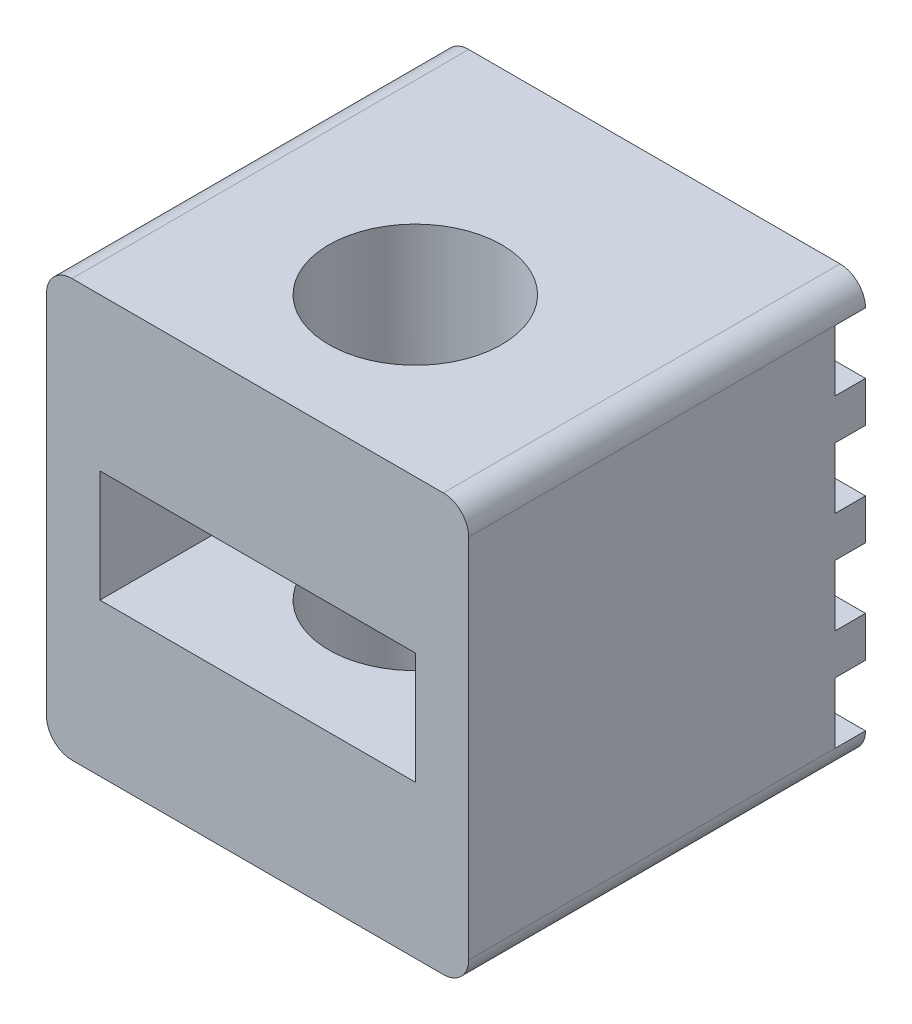
ISO-10303-21;
HEADER;
FILE_DESCRIPTION(('STEP AP214'),'2;1');
FILE_NAME('part.step','',(''),(''),'','','');
FILE_SCHEMA(('AUTOMOTIVE_DESIGN { 1 0 10303 214 1 1 1 1 }'));
ENDSEC;
DATA;
#1=APPLICATION_CONTEXT('core data for automotive mechanical design processes');
#2=APPLICATION_PROTOCOL_DEFINITION('international standard','automotive_design',2000,#1);
#3=PRODUCT_CONTEXT('',#1,'mechanical');
#4=PRODUCT('Part','Part','',(#3));
#5=PRODUCT_RELATED_PRODUCT_CATEGORY('part','',(#4));
#6=PRODUCT_DEFINITION_FORMATION('','',#4);
#7=PRODUCT_DEFINITION_CONTEXT('part definition',#1,'design');
#8=PRODUCT_DEFINITION('design','',#6,#7);
#9=PRODUCT_DEFINITION_SHAPE('','',#8);
#10=(LENGTH_UNIT() NAMED_UNIT(*) SI_UNIT(.MILLI.,.METRE.));
#11=(NAMED_UNIT(*) PLANE_ANGLE_UNIT() SI_UNIT($,.RADIAN.));
#12=(NAMED_UNIT(*) SI_UNIT($,.STERADIAN.) SOLID_ANGLE_UNIT());
#13=UNCERTAINTY_MEASURE_WITH_UNIT(LENGTH_MEASURE(1.E-05),#10,'distance_accuracy_value','');
#14=(GEOMETRIC_REPRESENTATION_CONTEXT(3) GLOBAL_UNCERTAINTY_ASSIGNED_CONTEXT((#13)) GLOBAL_UNIT_ASSIGNED_CONTEXT((#10,
#11,#12)) REPRESENTATION_CONTEXT('',''));
#15=CARTESIAN_POINT('',(0.,0.,0.));
#16=DIRECTION('',(0.,0.,1.));
#17=DIRECTION('',(1.,0.,0.));
#18=AXIS2_PLACEMENT_3D('',#15,#16,#17);
#19=CARTESIAN_POINT('',(-4.15,4.1,-3.9));
#20=DIRECTION('',(0.,0.,1.));
#21=DIRECTION('',(1.,0.,0.));
#22=AXIS2_PLACEMENT_3D('',#19,#20,#21);
#23=PLANE('',#22);
#24=DIRECTION('',(-1.,0.,0.));
#25=VECTOR('',#24,1.);
#26=CARTESIAN_POINT('',(-4.15,4.1,-3.9));
#27=LINE('',#26,#25);
#28=CARTESIAN_POINT('',(3.65,4.1,-3.9));
#29=VERTEX_POINT('',#28);
#30=CARTESIAN_POINT('',(-3.65,4.1,-3.9));
#31=VERTEX_POINT('',#30);
#32=EDGE_CURVE('E354',#29,#31,#27,.T.);
#33=ORIENTED_EDGE('',*,*,#32,.F.);
#34=CARTESIAN_POINT('',(3.65,3.6,-3.9));
#35=DIRECTION('',(0.,0.,1.));
#36=DIRECTION('',(1.,0.,0.));
#37=AXIS2_PLACEMENT_3D('',#34,#35,#36);
#38=CIRCLE('',#37,0.5);
#39=CARTESIAN_POINT('',(4.15,3.6,-3.9));
#40=VERTEX_POINT('',#39);
#41=EDGE_CURVE('E395',#29,#40,#38,.F.);
#42=ORIENTED_EDGE('',*,*,#41,.T.);
#43=DIRECTION('',(-1.,0.,0.));
#44=VECTOR('',#43,1.);
#45=CARTESIAN_POINT('',(-4.15,3.6,-3.9));
#46=LINE('',#45,#44);
#47=CARTESIAN_POINT('',(-4.15,3.6,-3.9));
#48=VERTEX_POINT('',#47);
#49=EDGE_CURVE('E350',#40,#48,#46,.T.);
#50=ORIENTED_EDGE('',*,*,#49,.T.);
#51=CARTESIAN_POINT('',(-3.65,3.6,-3.9));
#52=DIRECTION('',(0.,0.,1.));
#53=DIRECTION('',(1.,0.,0.));
#54=AXIS2_PLACEMENT_3D('',#51,#52,#53);
#55=CIRCLE('',#54,0.5);
#56=EDGE_CURVE('E393',#48,#31,#55,.F.);
#57=ORIENTED_EDGE('',*,*,#56,.T.);
#58=EDGE_LOOP('',(#33,#42,#50,#57));
#59=FACE_BOUND('',#58,.T.);
#60=ADVANCED_FACE('F32',(#59),#23,.F.);
#61=DIRECTION('',(0.,-1.,0.));
#62=VECTOR('',#61,1.);
#63=CARTESIAN_POINT('',(-4.15,4.1,-3.9));
#64=LINE('',#63,#62);
#65=CARTESIAN_POINT('',(-4.15,2.4,-3.9));
#66=VERTEX_POINT('',#65);
#67=CARTESIAN_POINT('',(-4.15,1.6,-3.9));
#68=VERTEX_POINT('',#67);
#69=EDGE_CURVE('E374',#66,#68,#64,.T.);
#70=ORIENTED_EDGE('',*,*,#69,.F.);
#71=DIRECTION('',(-1.,0.,0.));
#72=VECTOR('',#71,1.);
#73=CARTESIAN_POINT('',(4.15,2.4,-3.9));
#74=LINE('',#73,#72);
#75=CARTESIAN_POINT('',(4.15,2.4,-3.9));
#76=VERTEX_POINT('',#75);
#77=EDGE_CURVE('E322',#76,#66,#74,.T.);
#78=ORIENTED_EDGE('',*,*,#77,.F.);
#79=DIRECTION('',(0.,-1.,0.));
#80=VECTOR('',#79,1.);
#81=CARTESIAN_POINT('',(4.15,4.1,-3.9));
#82=LINE('',#81,#80);
#83=CARTESIAN_POINT('',(4.15,1.6,-3.9));
#84=VERTEX_POINT('',#83);
#85=EDGE_CURVE('E379',#76,#84,#82,.T.);
#86=ORIENTED_EDGE('',*,*,#85,.T.);
#87=DIRECTION('',(-1.,0.,0.));
#88=VECTOR('',#87,1.);
#89=CARTESIAN_POINT('',(4.15,1.6,-3.9));
#90=LINE('',#89,#88);
#91=EDGE_CURVE('E324',#84,#68,#90,.T.);
#92=ORIENTED_EDGE('',*,*,#91,.T.);
#93=EDGE_LOOP('',(#70,#78,#86,#92));
#94=FACE_BOUND('',#93,.T.);
#95=ADVANCED_FACE('F472',(#94),#23,.F.);
#96=CARTESIAN_POINT('',(-4.15,0.4,-3.9));
#97=VERTEX_POINT('',#96);
#98=CARTESIAN_POINT('',(-4.15,-0.4,-3.9));
#99=VERTEX_POINT('',#98);
#100=EDGE_CURVE('E373',#97,#99,#64,.T.);
#101=ORIENTED_EDGE('',*,*,#100,.F.);
#102=DIRECTION('',(-1.,0.,0.));
#103=VECTOR('',#102,1.);
#104=CARTESIAN_POINT('',(4.15,0.4,-3.9));
#105=LINE('',#104,#103);
#106=CARTESIAN_POINT('',(4.15,0.4,-3.9));
#107=VERTEX_POINT('',#106);
#108=EDGE_CURVE('E331',#107,#97,#105,.T.);
#109=ORIENTED_EDGE('',*,*,#108,.F.);
#110=CARTESIAN_POINT('',(4.15,-0.4,-3.9));
#111=VERTEX_POINT('',#110);
#112=EDGE_CURVE('E378',#107,#111,#82,.T.);
#113=ORIENTED_EDGE('',*,*,#112,.T.);
#114=DIRECTION('',(-1.,0.,0.));
#115=VECTOR('',#114,1.);
#116=CARTESIAN_POINT('',(4.15,-0.4,-3.9));
#117=LINE('',#116,#115);
#118=EDGE_CURVE('E333',#111,#99,#117,.T.);
#119=ORIENTED_EDGE('',*,*,#118,.T.);
#120=EDGE_LOOP('',(#101,#109,#113,#119));
#121=FACE_BOUND('',#120,.T.);
#122=ADVANCED_FACE('F483',(#121),#23,.F.);
#123=CARTESIAN_POINT('',(-4.15,-1.6,-3.9));
#124=VERTEX_POINT('',#123);
#125=CARTESIAN_POINT('',(-4.15,-2.4,-3.9));
#126=VERTEX_POINT('',#125);
#127=EDGE_CURVE('E370',#124,#126,#64,.T.);
#128=ORIENTED_EDGE('',*,*,#127,.F.);
#129=DIRECTION('',(-1.,0.,0.));
#130=VECTOR('',#129,1.);
#131=CARTESIAN_POINT('',(4.15,-1.6,-3.9));
#132=LINE('',#131,#130);
#133=CARTESIAN_POINT('',(4.15,-1.6,-3.9));
#134=VERTEX_POINT('',#133);
#135=EDGE_CURVE('E340',#134,#124,#132,.T.);
#136=ORIENTED_EDGE('',*,*,#135,.F.);
#137=CARTESIAN_POINT('',(4.15,-2.4,-3.9));
#138=VERTEX_POINT('',#137);
#139=EDGE_CURVE('E375',#134,#138,#82,.T.);
#140=ORIENTED_EDGE('',*,*,#139,.T.);
#141=DIRECTION('',(-1.,0.,0.));
#142=VECTOR('',#141,1.);
#143=CARTESIAN_POINT('',(4.15,-2.4,-3.9));
#144=LINE('',#143,#142);
#145=EDGE_CURVE('E342',#138,#126,#144,.T.);
#146=ORIENTED_EDGE('',*,*,#145,.T.);
#147=EDGE_LOOP('',(#128,#136,#140,#146));
#148=FACE_BOUND('',#147,.T.);
#149=ADVANCED_FACE('F498',(#148),#23,.F.);
#150=CARTESIAN_POINT('',(4.15,4.1,3.9));
#151=DIRECTION('',(-1.,0.,0.));
#152=DIRECTION('',(0.,0.,1.));
#153=AXIS2_PLACEMENT_3D('',#150,#151,#152);
#154=PLANE('',#153);
#155=DIRECTION('',(0.,1.,0.));
#156=VECTOR('',#155,1.);
#157=CARTESIAN_POINT('',(4.15,3.6,-3.3));
#158=LINE('',#157,#156);
#159=CARTESIAN_POINT('',(4.15,2.4,-3.3));
#160=VERTEX_POINT('',#159);
#161=CARTESIAN_POINT('',(4.15,3.6,-3.3));
#162=VERTEX_POINT('',#161);
#163=EDGE_CURVE('E282',#160,#162,#158,.T.);
#164=ORIENTED_EDGE('',*,*,#163,.T.);
#165=DIRECTION('',(0.,0.,-1.));
#166=VECTOR('',#165,1.);
#167=CARTESIAN_POINT('',(4.15,3.6,3.9));
#168=LINE('',#167,#166);
#169=CARTESIAN_POINT('',(4.15,3.6,3.9));
#170=VERTEX_POINT('',#169);
#171=EDGE_CURVE('E400',#162,#170,#168,.F.);
#172=ORIENTED_EDGE('',*,*,#171,.T.);
#173=DIRECTION('',(0.,-1.,0.));
#174=VECTOR('',#173,1.);
#175=CARTESIAN_POINT('',(4.15,4.1,3.9));
#176=LINE('',#175,#174);
#177=CARTESIAN_POINT('',(4.15,-3.6,3.9));
#178=VERTEX_POINT('',#177);
#179=EDGE_CURVE('E361',#170,#178,#176,.T.);
#180=ORIENTED_EDGE('',*,*,#179,.T.);
#181=DIRECTION('',(0.,0.,-1.));
#182=VECTOR('',#181,1.);
#183=CARTESIAN_POINT('',(4.15,-3.6,-3.9));
#184=LINE('',#183,#182);
#185=CARTESIAN_POINT('',(4.15,-3.6,-3.3));
#186=VERTEX_POINT('',#185);
#187=EDGE_CURVE('E397',#178,#186,#184,.T.);
#188=ORIENTED_EDGE('',*,*,#187,.T.);
#189=DIRECTION('',(0.,1.,0.));
#190=VECTOR('',#189,1.);
#191=CARTESIAN_POINT('',(4.15,-2.4,-3.3));
#192=LINE('',#191,#190);
#193=CARTESIAN_POINT('',(4.15,-2.4,-3.3));
#194=VERTEX_POINT('',#193);
#195=EDGE_CURVE('E254',#186,#194,#192,.T.);
#196=ORIENTED_EDGE('',*,*,#195,.T.);
#197=DIRECTION('',(0.,0.,-1.));
#198=VECTOR('',#197,1.);
#199=CARTESIAN_POINT('',(4.15,-2.4,-3.9));
#200=LINE('',#199,#198);
#201=EDGE_CURVE('E258',#194,#138,#200,.T.);
#202=ORIENTED_EDGE('',*,*,#201,.T.);
#203=ORIENTED_EDGE('',*,*,#139,.F.);
#204=DIRECTION('',(0.,0.,1.));
#205=VECTOR('',#204,1.);
#206=CARTESIAN_POINT('',(4.15,-1.6,-3.3));
#207=LINE('',#206,#205);
#208=CARTESIAN_POINT('',(4.15,-1.6,-3.3));
#209=VERTEX_POINT('',#208);
#210=EDGE_CURVE('E261',#134,#209,#207,.T.);
#211=ORIENTED_EDGE('',*,*,#210,.T.);
#212=DIRECTION('',(0.,1.,0.));
#213=VECTOR('',#212,1.);
#214=CARTESIAN_POINT('',(4.15,-0.4,-3.3));
#215=LINE('',#214,#213);
#216=CARTESIAN_POINT('',(4.15,-0.4,-3.3));
#217=VERTEX_POINT('',#216);
#218=EDGE_CURVE('E264',#209,#217,#215,.T.);
#219=ORIENTED_EDGE('',*,*,#218,.T.);
#220=DIRECTION('',(0.,0.,-1.));
#221=VECTOR('',#220,1.);
#222=CARTESIAN_POINT('',(4.15,-0.4,-3.9));
#223=LINE('',#222,#221);
#224=EDGE_CURVE('E267',#217,#111,#223,.T.);
#225=ORIENTED_EDGE('',*,*,#224,.T.);
#226=ORIENTED_EDGE('',*,*,#112,.F.);
#227=DIRECTION('',(0.,0.,1.));
#228=VECTOR('',#227,1.);
#229=CARTESIAN_POINT('',(4.15,0.4,-3.3));
#230=LINE('',#229,#228);
#231=CARTESIAN_POINT('',(4.15,0.4,-3.3));
#232=VERTEX_POINT('',#231);
#233=EDGE_CURVE('E270',#107,#232,#230,.T.);
#234=ORIENTED_EDGE('',*,*,#233,.T.);
#235=DIRECTION('',(0.,1.,0.));
#236=VECTOR('',#235,1.);
#237=CARTESIAN_POINT('',(4.15,1.6,-3.3));
#238=LINE('',#237,#236);
#239=CARTESIAN_POINT('',(4.15,1.6,-3.3));
#240=VERTEX_POINT('',#239);
#241=EDGE_CURVE('E273',#232,#240,#238,.T.);
#242=ORIENTED_EDGE('',*,*,#241,.T.);
#243=DIRECTION('',(0.,0.,-1.));
#244=VECTOR('',#243,1.);
#245=CARTESIAN_POINT('',(4.15,1.6,-3.9));
#246=LINE('',#245,#244);
#247=EDGE_CURVE('E276',#240,#84,#246,.T.);
#248=ORIENTED_EDGE('',*,*,#247,.T.);
#249=ORIENTED_EDGE('',*,*,#85,.F.);
#250=DIRECTION('',(0.,0.,1.));
#251=VECTOR('',#250,1.);
#252=CARTESIAN_POINT('',(4.15,2.4,-3.3));
#253=LINE('',#252,#251);
#254=EDGE_CURVE('E279',#76,#160,#253,.T.);
#255=ORIENTED_EDGE('',*,*,#254,.T.);
#256=EDGE_LOOP('',(#164,#172,#180,#188,#196,#202,#203,#211,#219,#225,#226,#234,#242,#248,#249,#255));
#257=FACE_BOUND('',#256,.T.);
#258=ADVANCED_FACE('F441',(#257),#154,.F.);
#259=DIRECTION('',(1.,0.,0.));
#260=VECTOR('',#259,1.);
#261=CARTESIAN_POINT('',(-4.15,-3.6,-3.9));
#262=LINE('',#261,#260);
#263=CARTESIAN_POINT('',(-4.15,-3.6,-3.9));
#264=VERTEX_POINT('',#263);
#265=CARTESIAN_POINT('',(4.15,-3.6,-3.9));
#266=VERTEX_POINT('',#265);
#267=EDGE_CURVE('E319',#264,#266,#262,.T.);
#268=ORIENTED_EDGE('',*,*,#267,.T.);
#269=CARTESIAN_POINT('',(3.65,-3.6,-3.9));
#270=DIRECTION('',(0.,0.,1.));
#271=DIRECTION('',(1.,0.,0.));
#272=AXIS2_PLACEMENT_3D('',#269,#270,#271);
#273=CIRCLE('',#272,0.5);
#274=CARTESIAN_POINT('',(3.65,-4.1,-3.9));
#275=VERTEX_POINT('',#274);
#276=EDGE_CURVE('E54',#266,#275,#273,.F.);
#277=ORIENTED_EDGE('',*,*,#276,.T.);
#278=DIRECTION('',(-1.,0.,0.));
#279=VECTOR('',#278,1.);
#280=CARTESIAN_POINT('',(-4.15,-4.1,-3.9));
#281=LINE('',#280,#279);
#282=CARTESIAN_POINT('',(-3.65,-4.1,-3.9));
#283=VERTEX_POINT('',#282);
#284=EDGE_CURVE('E353',#275,#283,#281,.T.);
#285=ORIENTED_EDGE('',*,*,#284,.T.);
#286=CARTESIAN_POINT('',(-3.65,-3.6,-3.9));
#287=DIRECTION('',(0.,0.,1.));
#288=DIRECTION('',(1.,0.,0.));
#289=AXIS2_PLACEMENT_3D('',#286,#287,#288);
#290=CIRCLE('',#289,0.5);
#291=EDGE_CURVE('E410',#283,#264,#290,.F.);
#292=ORIENTED_EDGE('',*,*,#291,.T.);
#293=EDGE_LOOP('',(#268,#277,#285,#292));
#294=FACE_BOUND('',#293,.T.);
#295=ADVANCED_FACE('F430',(#294),#23,.F.);
#296=CARTESIAN_POINT('',(-4.15,4.1,3.9));
#297=DIRECTION('',(1.,0.,0.));
#298=DIRECTION('',(0.,0.,-1.));
#299=AXIS2_PLACEMENT_3D('',#296,#297,#298);
#300=PLANE('',#299);
#301=DIRECTION('',(0.,-1.,0.));
#302=VECTOR('',#301,1.);
#303=CARTESIAN_POINT('',(-4.15,4.1,3.9));
#304=LINE('',#303,#302);
#305=CARTESIAN_POINT('',(-4.15,3.6,3.9));
#306=VERTEX_POINT('',#305);
#307=CARTESIAN_POINT('',(-4.15,-3.6,3.9));
#308=VERTEX_POINT('',#307);
#309=EDGE_CURVE('E367',#306,#308,#304,.T.);
#310=ORIENTED_EDGE('',*,*,#309,.F.);
#311=DIRECTION('',(0.,0.,1.));
#312=VECTOR('',#311,1.);
#313=CARTESIAN_POINT('',(-4.15,3.6,3.9));
#314=LINE('',#313,#312);
#315=CARTESIAN_POINT('',(-4.15,3.6,-3.3));
#316=VERTEX_POINT('',#315);
#317=EDGE_CURVE('E11',#306,#316,#314,.F.);
#318=ORIENTED_EDGE('',*,*,#317,.T.);
#319=DIRECTION('',(0.,1.,0.));
#320=VECTOR('',#319,1.);
#321=CARTESIAN_POINT('',(-4.15,3.6,-3.3));
#322=LINE('',#321,#320);
#323=CARTESIAN_POINT('',(-4.15,2.4,-3.3));
#324=VERTEX_POINT('',#323);
#325=EDGE_CURVE('E312',#324,#316,#322,.T.);
#326=ORIENTED_EDGE('',*,*,#325,.F.);
#327=DIRECTION('',(0.,0.,1.));
#328=VECTOR('',#327,1.);
#329=CARTESIAN_POINT('',(-4.15,2.4,-3.3));
#330=LINE('',#329,#328);
#331=EDGE_CURVE('E309',#66,#324,#330,.T.);
#332=ORIENTED_EDGE('',*,*,#331,.F.);
#333=ORIENTED_EDGE('',*,*,#69,.T.);
#334=DIRECTION('',(0.,0.,-1.));
#335=VECTOR('',#334,1.);
#336=CARTESIAN_POINT('',(-4.15,1.6,-3.9));
#337=LINE('',#336,#335);
#338=CARTESIAN_POINT('',(-4.15,1.6,-3.3));
#339=VERTEX_POINT('',#338);
#340=EDGE_CURVE('E307',#339,#68,#337,.T.);
#341=ORIENTED_EDGE('',*,*,#340,.F.);
#342=DIRECTION('',(0.,1.,0.));
#343=VECTOR('',#342,1.);
#344=CARTESIAN_POINT('',(-4.15,1.6,-3.3));
#345=LINE('',#344,#343);
#346=CARTESIAN_POINT('',(-4.15,0.4,-3.3));
#347=VERTEX_POINT('',#346);
#348=EDGE_CURVE('E304',#347,#339,#345,.T.);
#349=ORIENTED_EDGE('',*,*,#348,.F.);
#350=DIRECTION('',(0.,0.,1.));
#351=VECTOR('',#350,1.);
#352=CARTESIAN_POINT('',(-4.15,0.4,-3.3));
#353=LINE('',#352,#351);
#354=EDGE_CURVE('E301',#97,#347,#353,.T.);
#355=ORIENTED_EDGE('',*,*,#354,.F.);
#356=ORIENTED_EDGE('',*,*,#100,.T.);
#357=DIRECTION('',(0.,0.,-1.));
#358=VECTOR('',#357,1.);
#359=CARTESIAN_POINT('',(-4.15,-0.4,-3.9));
#360=LINE('',#359,#358);
#361=CARTESIAN_POINT('',(-4.15,-0.4,-3.3));
#362=VERTEX_POINT('',#361);
#363=EDGE_CURVE('E299',#362,#99,#360,.T.);
#364=ORIENTED_EDGE('',*,*,#363,.F.);
#365=DIRECTION('',(0.,1.,0.));
#366=VECTOR('',#365,1.);
#367=CARTESIAN_POINT('',(-4.15,-0.4,-3.3));
#368=LINE('',#367,#366);
#369=CARTESIAN_POINT('',(-4.15,-1.6,-3.3));
#370=VERTEX_POINT('',#369);
#371=EDGE_CURVE('E296',#370,#362,#368,.T.);
#372=ORIENTED_EDGE('',*,*,#371,.F.);
#373=DIRECTION('',(0.,0.,1.));
#374=VECTOR('',#373,1.);
#375=CARTESIAN_POINT('',(-4.15,-1.6,-3.3));
#376=LINE('',#375,#374);
#377=EDGE_CURVE('E293',#124,#370,#376,.T.);
#378=ORIENTED_EDGE('',*,*,#377,.F.);
#379=ORIENTED_EDGE('',*,*,#127,.T.);
#380=DIRECTION('',(0.,0.,-1.));
#381=VECTOR('',#380,1.);
#382=CARTESIAN_POINT('',(-4.15,-2.4,-3.9));
#383=LINE('',#382,#381);
#384=CARTESIAN_POINT('',(-4.15,-2.4,-3.3));
#385=VERTEX_POINT('',#384);
#386=EDGE_CURVE('E291',#385,#126,#383,.T.);
#387=ORIENTED_EDGE('',*,*,#386,.F.);
#388=DIRECTION('',(0.,1.,0.));
#389=VECTOR('',#388,1.);
#390=CARTESIAN_POINT('',(-4.15,-2.4,-3.3));
#391=LINE('',#390,#389);
#392=CARTESIAN_POINT('',(-4.15,-3.6,-3.3));
#393=VERTEX_POINT('',#392);
#394=EDGE_CURVE('E248',#393,#385,#391,.T.);
#395=ORIENTED_EDGE('',*,*,#394,.F.);
#396=DIRECTION('',(0.,0.,1.));
#397=VECTOR('',#396,1.);
#398=CARTESIAN_POINT('',(-4.15,-3.6,3.9));
#399=LINE('',#398,#397);
#400=EDGE_CURVE('E40',#393,#308,#399,.T.);
#401=ORIENTED_EDGE('',*,*,#400,.T.);
#402=EDGE_LOOP('',(#310,#318,#326,#332,#333,#341,#349,#355,#356,#364,#372,#378,#379,#387,#395,#401));
#403=FACE_BOUND('',#402,.T.);
#404=ADVANCED_FACE('F418',(#403),#300,.F.);
#405=CARTESIAN_POINT('',(-4.15,4.1,3.9));
#406=DIRECTION('',(0.,0.,-1.));
#407=DIRECTION('',(-1.,0.,0.));
#408=AXIS2_PLACEMENT_3D('',#405,#406,#407);
#409=PLANE('',#408);
#410=DIRECTION('',(-1.,0.,0.));
#411=VECTOR('',#410,1.);
#412=CARTESIAN_POINT('',(-3.1,1.1,3.9));
#413=LINE('',#412,#411);
#414=CARTESIAN_POINT('',(3.1,1.1,3.9));
#415=VERTEX_POINT('',#414);
#416=CARTESIAN_POINT('',(-3.1,1.1,3.9));
#417=VERTEX_POINT('',#416);
#418=EDGE_CURVE('E242',#415,#417,#413,.T.);
#419=ORIENTED_EDGE('',*,*,#418,.F.);
#420=DIRECTION('',(0.,1.,0.));
#421=VECTOR('',#420,1.);
#422=CARTESIAN_POINT('',(3.1,-1.1,3.9));
#423=LINE('',#422,#421);
#424=CARTESIAN_POINT('',(3.1,-1.1,3.9));
#425=VERTEX_POINT('',#424);
#426=EDGE_CURVE('E213',#425,#415,#423,.T.);
#427=ORIENTED_EDGE('',*,*,#426,.F.);
#428=DIRECTION('',(1.,0.,0.));
#429=VECTOR('',#428,1.);
#430=CARTESIAN_POINT('',(-3.1,-1.1,3.9));
#431=LINE('',#430,#429);
#432=CARTESIAN_POINT('',(-3.1,-1.1,3.9));
#433=VERTEX_POINT('',#432);
#434=EDGE_CURVE('E230',#433,#425,#431,.T.);
#435=ORIENTED_EDGE('',*,*,#434,.F.);
#436=DIRECTION('',(0.,-1.,0.));
#437=VECTOR('',#436,1.);
#438=CARTESIAN_POINT('',(-3.1,-1.1,3.9));
#439=LINE('',#438,#437);
#440=EDGE_CURVE('E233',#417,#433,#439,.T.);
#441=ORIENTED_EDGE('',*,*,#440,.F.);
#442=EDGE_LOOP('',(#419,#427,#435,#441));
#443=FACE_BOUND('',#442,.T.);
#444=ORIENTED_EDGE('',*,*,#179,.F.);
#445=CARTESIAN_POINT('',(3.65,3.6,3.9));
#446=DIRECTION('',(0.,0.,-1.));
#447=DIRECTION('',(-1.,0.,0.));
#448=AXIS2_PLACEMENT_3D('',#445,#446,#447);
#449=CIRCLE('',#448,0.5);
#450=CARTESIAN_POINT('',(3.65,4.1,3.9));
#451=VERTEX_POINT('',#450);
#452=EDGE_CURVE('E408',#170,#451,#449,.F.);
#453=ORIENTED_EDGE('',*,*,#452,.T.);
#454=DIRECTION('',(1.,0.,0.));
#455=VECTOR('',#454,1.);
#456=CARTESIAN_POINT('',(-4.15,4.1,3.9));
#457=LINE('',#456,#455);
#458=CARTESIAN_POINT('',(-3.65,4.1,3.9));
#459=VERTEX_POINT('',#458);
#460=EDGE_CURVE('E357',#459,#451,#457,.T.);
#461=ORIENTED_EDGE('',*,*,#460,.F.);
#462=CARTESIAN_POINT('',(-3.65,3.6,3.9));
#463=DIRECTION('',(0.,0.,-1.));
#464=DIRECTION('',(-1.,0.,0.));
#465=AXIS2_PLACEMENT_3D('',#462,#463,#464);
#466=CIRCLE('',#465,0.5);
#467=EDGE_CURVE('E404',#459,#306,#466,.F.);
#468=ORIENTED_EDGE('',*,*,#467,.T.);
#469=ORIENTED_EDGE('',*,*,#309,.T.);
#470=CARTESIAN_POINT('',(-3.65,-3.6,3.9));
#471=DIRECTION('',(0.,0.,-1.));
#472=DIRECTION('',(-1.,0.,0.));
#473=AXIS2_PLACEMENT_3D('',#470,#471,#472);
#474=CIRCLE('',#473,0.5);
#475=CARTESIAN_POINT('',(-3.65,-4.1,3.9));
#476=VERTEX_POINT('',#475);
#477=EDGE_CURVE('E402',#308,#476,#474,.F.);
#478=ORIENTED_EDGE('',*,*,#477,.T.);
#479=DIRECTION('',(1.,0.,0.));
#480=VECTOR('',#479,1.);
#481=CARTESIAN_POINT('',(-4.15,-4.1,3.9));
#482=LINE('',#481,#480);
#483=CARTESIAN_POINT('',(3.65,-4.1,3.9));
#484=VERTEX_POINT('',#483);
#485=EDGE_CURVE('E358',#476,#484,#482,.T.);
#486=ORIENTED_EDGE('',*,*,#485,.T.);
#487=CARTESIAN_POINT('',(3.65,-3.6,3.9));
#488=DIRECTION('',(0.,0.,-1.));
#489=DIRECTION('',(-1.,0.,0.));
#490=AXIS2_PLACEMENT_3D('',#487,#488,#489);
#491=CIRCLE('',#490,0.5);
#492=EDGE_CURVE('E406',#484,#178,#491,.F.);
#493=ORIENTED_EDGE('',*,*,#492,.T.);
#494=EDGE_LOOP('',(#444,#453,#461,#468,#469,#478,#486,#493));
#495=FACE_BOUND('',#494,.T.);
#496=ADVANCED_FACE('F426',(#443,#495),#409,.F.);
#497=CARTESIAN_POINT('',(0.,4.1,0.));
#498=DIRECTION('',(0.,-1.,0.));
#499=DIRECTION('',(0.,0.,-1.));
#500=AXIS2_PLACEMENT_3D('',#497,#498,#499);
#501=PLANE('',#500);
#502=CARTESIAN_POINT('',(0.,4.1,0.800000000000001));
#503=DIRECTION('',(0.,-1.,0.));
#504=DIRECTION('',(0.,0.,-1.));
#505=AXIS2_PLACEMENT_3D('',#502,#503,#504);
#506=CIRCLE('',#505,1.7);
#507=CARTESIAN_POINT('',(0.,4.1,-0.899999999999999));
#508=VERTEX_POINT('',#507);
#509=EDGE_CURVE('E387',#508,#508,#506,.T.);
#510=ORIENTED_EDGE('',*,*,#509,.T.);
#511=EDGE_LOOP('',(#510));
#512=FACE_BOUND('',#511,.T.);
#513=ORIENTED_EDGE('',*,*,#460,.T.);
#514=DIRECTION('',(0.,0.,-1.));
#515=VECTOR('',#514,1.);
#516=CARTESIAN_POINT('',(3.65,4.1,0.));
#517=LINE('',#516,#515);
#518=EDGE_CURVE('E390',#451,#29,#517,.T.);
#519=ORIENTED_EDGE('',*,*,#518,.T.);
#520=ORIENTED_EDGE('',*,*,#32,.T.);
#521=DIRECTION('',(0.,0.,1.));
#522=VECTOR('',#521,1.);
#523=CARTESIAN_POINT('',(-3.65,4.1,0.));
#524=LINE('',#523,#522);
#525=EDGE_CURVE('E383',#31,#459,#524,.T.);
#526=ORIENTED_EDGE('',*,*,#525,.T.);
#527=EDGE_LOOP('',(#513,#519,#520,#526));
#528=FACE_BOUND('',#527,.T.);
#529=ADVANCED_FACE('F449',(#512,#528),#501,.F.);
#530=CARTESIAN_POINT('',(0.,-4.1,0.));
#531=DIRECTION('',(0.,-1.,0.));
#532=DIRECTION('',(0.,0.,-1.));
#533=AXIS2_PLACEMENT_3D('',#530,#531,#532);
#534=PLANE('',#533);
#535=CARTESIAN_POINT('',(0.,-4.1,0.800000000000001));
#536=DIRECTION('',(0.,-1.,0.));
#537=DIRECTION('',(0.,0.,-1.));
#538=AXIS2_PLACEMENT_3D('',#535,#536,#537);
#539=CIRCLE('',#538,1.7);
#540=CARTESIAN_POINT('',(0.,-4.1,-0.899999999999999));
#541=VERTEX_POINT('',#540);
#542=EDGE_CURVE('E739',#541,#541,#539,.T.);
#543=ORIENTED_EDGE('',*,*,#542,.F.);
#544=EDGE_LOOP('',(#543));
#545=FACE_BOUND('',#544,.T.);
#546=ORIENTED_EDGE('',*,*,#284,.F.);
#547=DIRECTION('',(0.,0.,-1.));
#548=VECTOR('',#547,1.);
#549=CARTESIAN_POINT('',(3.65,-4.1,3.9));
#550=LINE('',#549,#548);
#551=EDGE_CURVE('E414',#275,#484,#550,.F.);
#552=ORIENTED_EDGE('',*,*,#551,.T.);
#553=ORIENTED_EDGE('',*,*,#485,.F.);
#554=DIRECTION('',(0.,0.,1.));
#555=VECTOR('',#554,1.);
#556=CARTESIAN_POINT('',(-3.65,-4.1,-3.9));
#557=LINE('',#556,#555);
#558=EDGE_CURVE('E47',#476,#283,#557,.F.);
#559=ORIENTED_EDGE('',*,*,#558,.T.);
#560=EDGE_LOOP('',(#546,#552,#553,#559));
#561=FACE_BOUND('',#560,.T.);
#562=ADVANCED_FACE('F512',(#545,#561),#534,.T.);
#563=CARTESIAN_POINT('',(4.15,-3.6,-3.3));
#564=DIRECTION('',(0.,-1.,0.));
#565=DIRECTION('',(0.,0.,-1.));
#566=AXIS2_PLACEMENT_3D('',#563,#564,#565);
#567=PLANE('',#566);
#568=DIRECTION('',(0.,0.,-1.));
#569=VECTOR('',#568,1.);
#570=CARTESIAN_POINT('',(-4.15,-3.6,3.9));
#571=LINE('',#570,#569);
#572=EDGE_CURVE('E380',#393,#264,#571,.T.);
#573=ORIENTED_EDGE('',*,*,#572,.F.);
#574=DIRECTION('',(-1.,0.,0.));
#575=VECTOR('',#574,1.);
#576=CARTESIAN_POINT('',(4.15,-3.6,-3.3));
#577=LINE('',#576,#575);
#578=EDGE_CURVE('E288',#186,#393,#577,.T.);
#579=ORIENTED_EDGE('',*,*,#578,.F.);
#580=DIRECTION('',(0.,0.,1.));
#581=VECTOR('',#580,1.);
#582=CARTESIAN_POINT('',(4.15,-3.6,-3.3));
#583=LINE('',#582,#581);
#584=EDGE_CURVE('E252',#266,#186,#583,.T.);
#585=ORIENTED_EDGE('',*,*,#584,.F.);
#586=ORIENTED_EDGE('',*,*,#267,.F.);
#587=EDGE_LOOP('',(#573,#579,#585,#586));
#588=FACE_BOUND('',#587,.T.);
#589=ADVANCED_FACE('F432',(#588),#567,.F.);
#590=CARTESIAN_POINT('',(4.15,-2.4,-3.3));
#591=DIRECTION('',(0.,0.,1.));
#592=DIRECTION('',(1.,0.,0.));
#593=AXIS2_PLACEMENT_3D('',#590,#591,#592);
#594=PLANE('',#593);
#595=ORIENTED_EDGE('',*,*,#394,.T.);
#596=DIRECTION('',(-1.,0.,0.));
#597=VECTOR('',#596,1.);
#598=CARTESIAN_POINT('',(4.15,-2.4,-3.3));
#599=LINE('',#598,#597);
#600=EDGE_CURVE('E345',#194,#385,#599,.T.);
#601=ORIENTED_EDGE('',*,*,#600,.F.);
#602=ORIENTED_EDGE('',*,*,#195,.F.);
#603=ORIENTED_EDGE('',*,*,#578,.T.);
#604=EDGE_LOOP('',(#595,#601,#602,#603));
#605=FACE_BOUND('',#604,.T.);
#606=ADVANCED_FACE('F503',(#605),#594,.F.);
#607=CARTESIAN_POINT('',(4.15,-2.4,-3.9));
#608=DIRECTION('',(0.,1.,0.));
#609=DIRECTION('',(0.,0.,1.));
#610=AXIS2_PLACEMENT_3D('',#607,#608,#609);
#611=PLANE('',#610);
#612=ORIENTED_EDGE('',*,*,#386,.T.);
#613=ORIENTED_EDGE('',*,*,#145,.F.);
#614=ORIENTED_EDGE('',*,*,#201,.F.);
#615=ORIENTED_EDGE('',*,*,#600,.T.);
#616=EDGE_LOOP('',(#612,#613,#614,#615));
#617=FACE_BOUND('',#616,.T.);
#618=ADVANCED_FACE('F501',(#617),#611,.F.);
#619=CARTESIAN_POINT('',(4.15,-1.6,-3.3));
#620=DIRECTION('',(0.,-1.,0.));
#621=DIRECTION('',(0.,0.,-1.));
#622=AXIS2_PLACEMENT_3D('',#619,#620,#621);
#623=PLANE('',#622);
#624=ORIENTED_EDGE('',*,*,#377,.T.);
#625=DIRECTION('',(-1.,0.,0.));
#626=VECTOR('',#625,1.);
#627=CARTESIAN_POINT('',(4.15,-1.6,-3.3));
#628=LINE('',#627,#626);
#629=EDGE_CURVE('E338',#209,#370,#628,.T.);
#630=ORIENTED_EDGE('',*,*,#629,.F.);
#631=ORIENTED_EDGE('',*,*,#210,.F.);
#632=ORIENTED_EDGE('',*,*,#135,.T.);
#633=EDGE_LOOP('',(#624,#630,#631,#632));
#634=FACE_BOUND('',#633,.T.);
#635=ADVANCED_FACE('F510',(#634),#623,.F.);
#636=CARTESIAN_POINT('',(4.15,-0.4,-3.3));
#637=DIRECTION('',(0.,0.,1.));
#638=DIRECTION('',(1.,0.,0.));
#639=AXIS2_PLACEMENT_3D('',#636,#637,#638);
#640=PLANE('',#639);
#641=ORIENTED_EDGE('',*,*,#371,.T.);
#642=DIRECTION('',(-1.,0.,0.));
#643=VECTOR('',#642,1.);
#644=CARTESIAN_POINT('',(4.15,-0.4,-3.3));
#645=LINE('',#644,#643);
#646=EDGE_CURVE('E336',#217,#362,#645,.T.);
#647=ORIENTED_EDGE('',*,*,#646,.F.);
#648=ORIENTED_EDGE('',*,*,#218,.F.);
#649=ORIENTED_EDGE('',*,*,#629,.T.);
#650=EDGE_LOOP('',(#641,#647,#648,#649));
#651=FACE_BOUND('',#650,.T.);
#652=ADVANCED_FACE('F492',(#651),#640,.F.);
#653=CARTESIAN_POINT('',(4.15,-0.4,-3.9));
#654=DIRECTION('',(0.,1.,0.));
#655=DIRECTION('',(0.,0.,1.));
#656=AXIS2_PLACEMENT_3D('',#653,#654,#655);
#657=PLANE('',#656);
#658=ORIENTED_EDGE('',*,*,#363,.T.);
#659=ORIENTED_EDGE('',*,*,#118,.F.);
#660=ORIENTED_EDGE('',*,*,#224,.F.);
#661=ORIENTED_EDGE('',*,*,#646,.T.);
#662=EDGE_LOOP('',(#658,#659,#660,#661));
#663=FACE_BOUND('',#662,.T.);
#664=ADVANCED_FACE('F488',(#663),#657,.F.);
#665=CARTESIAN_POINT('',(4.15,0.4,-3.3));
#666=DIRECTION('',(0.,-1.,0.));
#667=DIRECTION('',(0.,0.,-1.));
#668=AXIS2_PLACEMENT_3D('',#665,#666,#667);
#669=PLANE('',#668);
#670=ORIENTED_EDGE('',*,*,#354,.T.);
#671=DIRECTION('',(-1.,0.,0.));
#672=VECTOR('',#671,1.);
#673=CARTESIAN_POINT('',(4.15,0.4,-3.3));
#674=LINE('',#673,#672);
#675=EDGE_CURVE('E329',#232,#347,#674,.T.);
#676=ORIENTED_EDGE('',*,*,#675,.F.);
#677=ORIENTED_EDGE('',*,*,#233,.F.);
#678=ORIENTED_EDGE('',*,*,#108,.T.);
#679=EDGE_LOOP('',(#670,#676,#677,#678));
#680=FACE_BOUND('',#679,.T.);
#681=ADVANCED_FACE('F585',(#680),#669,.F.);
#682=CARTESIAN_POINT('',(4.15,1.6,-3.3));
#683=DIRECTION('',(0.,0.,1.));
#684=DIRECTION('',(1.,0.,0.));
#685=AXIS2_PLACEMENT_3D('',#682,#683,#684);
#686=PLANE('',#685);
#687=ORIENTED_EDGE('',*,*,#348,.T.);
#688=DIRECTION('',(-1.,0.,0.));
#689=VECTOR('',#688,1.);
#690=CARTESIAN_POINT('',(4.15,1.6,-3.3));
#691=LINE('',#690,#689);
#692=EDGE_CURVE('E327',#240,#339,#691,.T.);
#693=ORIENTED_EDGE('',*,*,#692,.F.);
#694=ORIENTED_EDGE('',*,*,#241,.F.);
#695=ORIENTED_EDGE('',*,*,#675,.T.);
#696=EDGE_LOOP('',(#687,#693,#694,#695));
#697=FACE_BOUND('',#696,.T.);
#698=ADVANCED_FACE('F593',(#697),#686,.F.);
#699=CARTESIAN_POINT('',(4.15,1.6,-3.9));
#700=DIRECTION('',(0.,1.,0.));
#701=DIRECTION('',(0.,0.,1.));
#702=AXIS2_PLACEMENT_3D('',#699,#700,#701);
#703=PLANE('',#702);
#704=ORIENTED_EDGE('',*,*,#340,.T.);
#705=ORIENTED_EDGE('',*,*,#91,.F.);
#706=ORIENTED_EDGE('',*,*,#247,.F.);
#707=ORIENTED_EDGE('',*,*,#692,.T.);
#708=EDGE_LOOP('',(#704,#705,#706,#707));
#709=FACE_BOUND('',#708,.T.);
#710=ADVANCED_FACE('F602',(#709),#703,.F.);
#711=CARTESIAN_POINT('',(4.15,3.6,-8.9));
#712=DIRECTION('',(0.,1.,0.));
#713=DIRECTION('',(0.,0.,1.));
#714=AXIS2_PLACEMENT_3D('',#711,#712,#713);
#715=PLANE('',#714);
#716=DIRECTION('',(0.,0.,-1.));
#717=VECTOR('',#716,1.);
#718=CARTESIAN_POINT('',(4.15,3.6,-8.9));
#719=LINE('',#718,#717);
#720=EDGE_CURVE('E285',#162,#40,#719,.T.);
#721=ORIENTED_EDGE('',*,*,#720,.F.);
#722=DIRECTION('',(-1.,0.,0.));
#723=VECTOR('',#722,1.);
#724=CARTESIAN_POINT('',(4.15,3.6,-3.3));
#725=LINE('',#724,#723);
#726=EDGE_CURVE('E316',#162,#316,#725,.T.);
#727=ORIENTED_EDGE('',*,*,#726,.T.);
#728=DIRECTION('',(0.,0.,-1.));
#729=VECTOR('',#728,1.);
#730=CARTESIAN_POINT('',(-4.15,3.6,-8.9));
#731=LINE('',#730,#729);
#732=EDGE_CURVE('E255',#316,#48,#731,.T.);
#733=ORIENTED_EDGE('',*,*,#732,.T.);
#734=ORIENTED_EDGE('',*,*,#49,.F.);
#735=EDGE_LOOP('',(#721,#727,#733,#734));
#736=FACE_BOUND('',#735,.T.);
#737=ADVANCED_FACE('F461',(#736),#715,.F.);
#738=CARTESIAN_POINT('',(4.15,3.6,-3.3));
#739=DIRECTION('',(0.,0.,1.));
#740=DIRECTION('',(1.,0.,0.));
#741=AXIS2_PLACEMENT_3D('',#738,#739,#740);
#742=PLANE('',#741);
#743=ORIENTED_EDGE('',*,*,#325,.T.);
#744=ORIENTED_EDGE('',*,*,#726,.F.);
#745=ORIENTED_EDGE('',*,*,#163,.F.);
#746=DIRECTION('',(-1.,0.,0.));
#747=VECTOR('',#746,1.);
#748=CARTESIAN_POINT('',(4.15,2.4,-3.3));
#749=LINE('',#748,#747);
#750=EDGE_CURVE('E320',#160,#324,#749,.T.);
#751=ORIENTED_EDGE('',*,*,#750,.T.);
#752=EDGE_LOOP('',(#743,#744,#745,#751));
#753=FACE_BOUND('',#752,.T.);
#754=ADVANCED_FACE('F464',(#753),#742,.F.);
#755=CARTESIAN_POINT('',(4.15,2.4,-3.3));
#756=DIRECTION('',(0.,-1.,0.));
#757=DIRECTION('',(0.,0.,-1.));
#758=AXIS2_PLACEMENT_3D('',#755,#756,#757);
#759=PLANE('',#758);
#760=ORIENTED_EDGE('',*,*,#331,.T.);
#761=ORIENTED_EDGE('',*,*,#750,.F.);
#762=ORIENTED_EDGE('',*,*,#254,.F.);
#763=ORIENTED_EDGE('',*,*,#77,.T.);
#764=EDGE_LOOP('',(#760,#761,#762,#763));
#765=FACE_BOUND('',#764,.T.);
#766=ADVANCED_FACE('F466',(#765),#759,.F.);
#767=CARTESIAN_POINT('',(3.1,-1.1,-2.3));
#768=DIRECTION('',(1.,0.,0.));
#769=DIRECTION('',(0.,0.,-1.));
#770=AXIS2_PLACEMENT_3D('',#767,#768,#769);
#771=PLANE('',#770);
#772=ORIENTED_EDGE('',*,*,#426,.T.);
#773=DIRECTION('',(0.,0.,1.));
#774=VECTOR('',#773,1.);
#775=CARTESIAN_POINT('',(3.1,1.1,-2.3));
#776=LINE('',#775,#774);
#777=CARTESIAN_POINT('',(3.1,1.1,-2.3));
#778=VERTEX_POINT('',#777);
#779=EDGE_CURVE('E206',#778,#415,#776,.T.);
#780=ORIENTED_EDGE('',*,*,#779,.F.);
#781=DIRECTION('',(0.,1.,0.));
#782=VECTOR('',#781,1.);
#783=CARTESIAN_POINT('',(3.1,-1.1,-2.3));
#784=LINE('',#783,#782);
#785=CARTESIAN_POINT('',(3.1,-1.1,-2.3));
#786=VERTEX_POINT('',#785);
#787=EDGE_CURVE('E210',#786,#778,#784,.T.);
#788=ORIENTED_EDGE('',*,*,#787,.F.);
#789=DIRECTION('',(0.,0.,1.));
#790=VECTOR('',#789,1.);
#791=CARTESIAN_POINT('',(3.1,-1.1,-2.3));
#792=LINE('',#791,#790);
#793=EDGE_CURVE('E246',#786,#425,#792,.T.);
#794=ORIENTED_EDGE('',*,*,#793,.T.);
#795=EDGE_LOOP('',(#772,#780,#788,#794));
#796=FACE_BOUND('',#795,.T.);
#797=ADVANCED_FACE('F208',(#796),#771,.F.);
#798=CARTESIAN_POINT('',(-3.1,-1.1,-2.3));
#799=DIRECTION('',(0.,-1.,0.));
#800=DIRECTION('',(0.,0.,-1.));
#801=AXIS2_PLACEMENT_3D('',#798,#799,#800);
#802=PLANE('',#801);
#803=CARTESIAN_POINT('',(0.,-1.1,0.800000000000001));
#804=DIRECTION('',(0.,-1.,0.));
#805=DIRECTION('',(0.,0.,-1.));
#806=AXIS2_PLACEMENT_3D('',#803,#804,#805);
#807=CIRCLE('',#806,1.7);
#808=CARTESIAN_POINT('',(0.,-1.1,-0.899999999999999));
#809=VERTEX_POINT('',#808);
#810=EDGE_CURVE('E236',#809,#809,#807,.T.);
#811=ORIENTED_EDGE('',*,*,#810,.T.);
#812=EDGE_LOOP('',(#811));
#813=FACE_BOUND('',#812,.T.);
#814=ORIENTED_EDGE('',*,*,#434,.T.);
#815=ORIENTED_EDGE('',*,*,#793,.F.);
#816=DIRECTION('',(1.,0.,0.));
#817=VECTOR('',#816,1.);
#818=CARTESIAN_POINT('',(-3.1,-1.1,-2.3));
#819=LINE('',#818,#817);
#820=CARTESIAN_POINT('',(-3.1,-1.1,-2.3));
#821=VERTEX_POINT('',#820);
#822=EDGE_CURVE('E218',#821,#786,#819,.T.);
#823=ORIENTED_EDGE('',*,*,#822,.F.);
#824=DIRECTION('',(0.,0.,1.));
#825=VECTOR('',#824,1.);
#826=CARTESIAN_POINT('',(-3.1,-1.1,-2.3));
#827=LINE('',#826,#825);
#828=EDGE_CURVE('E249',#821,#433,#827,.T.);
#829=ORIENTED_EDGE('',*,*,#828,.T.);
#830=EDGE_LOOP('',(#814,#815,#823,#829));
#831=FACE_BOUND('',#830,.T.);
#832=ADVANCED_FACE('F640',(#813,#831),#802,.F.);
#833=CARTESIAN_POINT('',(-3.1,-1.1,-2.3));
#834=DIRECTION('',(-1.,0.,0.));
#835=DIRECTION('',(0.,0.,1.));
#836=AXIS2_PLACEMENT_3D('',#833,#834,#835);
#837=PLANE('',#836);
#838=ORIENTED_EDGE('',*,*,#440,.T.);
#839=ORIENTED_EDGE('',*,*,#828,.F.);
#840=DIRECTION('',(0.,-1.,0.));
#841=VECTOR('',#840,1.);
#842=CARTESIAN_POINT('',(-3.1,-1.1,-2.3));
#843=LINE('',#842,#841);
#844=CARTESIAN_POINT('',(-3.1,1.1,-2.3));
#845=VERTEX_POINT('',#844);
#846=EDGE_CURVE('E226',#845,#821,#843,.T.);
#847=ORIENTED_EDGE('',*,*,#846,.F.);
#848=DIRECTION('',(0.,0.,1.));
#849=VECTOR('',#848,1.);
#850=CARTESIAN_POINT('',(-3.1,1.1,-2.3));
#851=LINE('',#850,#849);
#852=EDGE_CURVE('E217',#845,#417,#851,.T.);
#853=ORIENTED_EDGE('',*,*,#852,.T.);
#854=EDGE_LOOP('',(#838,#839,#847,#853));
#855=FACE_BOUND('',#854,.T.);
#856=ADVANCED_FACE('F649',(#855),#837,.F.);
#857=CARTESIAN_POINT('',(-3.1,1.1,-2.3));
#858=DIRECTION('',(0.,1.,0.));
#859=DIRECTION('',(0.,0.,1.));
#860=AXIS2_PLACEMENT_3D('',#857,#858,#859);
#861=PLANE('',#860);
#862=CARTESIAN_POINT('',(0.,1.1,0.800000000000001));
#863=DIRECTION('',(0.,1.,0.));
#864=DIRECTION('',(0.,0.,1.));
#865=AXIS2_PLACEMENT_3D('',#862,#863,#864);
#866=CIRCLE('',#865,1.7);
#867=CARTESIAN_POINT('',(0.,1.1,2.5));
#868=VERTEX_POINT('',#867);
#869=EDGE_CURVE('E384',#868,#868,#866,.T.);
#870=ORIENTED_EDGE('',*,*,#869,.T.);
#871=EDGE_LOOP('',(#870));
#872=FACE_BOUND('',#871,.T.);
#873=ORIENTED_EDGE('',*,*,#418,.T.);
#874=ORIENTED_EDGE('',*,*,#852,.F.);
#875=DIRECTION('',(-1.,0.,0.));
#876=VECTOR('',#875,1.);
#877=CARTESIAN_POINT('',(-3.1,1.1,-2.3));
#878=LINE('',#877,#876);
#879=EDGE_CURVE('E221',#778,#845,#878,.T.);
#880=ORIENTED_EDGE('',*,*,#879,.F.);
#881=ORIENTED_EDGE('',*,*,#779,.T.);
#882=EDGE_LOOP('',(#873,#874,#880,#881));
#883=FACE_BOUND('',#882,.T.);
#884=ADVANCED_FACE('F222',(#872,#883),#861,.F.);
#885=CARTESIAN_POINT('',(0.,0.,-2.3));
#886=DIRECTION('',(0.,0.,-1.));
#887=DIRECTION('',(-1.,0.,0.));
#888=AXIS2_PLACEMENT_3D('',#885,#886,#887);
#889=PLANE('',#888);
#890=ORIENTED_EDGE('',*,*,#787,.T.);
#891=ORIENTED_EDGE('',*,*,#879,.T.);
#892=ORIENTED_EDGE('',*,*,#846,.T.);
#893=ORIENTED_EDGE('',*,*,#822,.T.);
#894=EDGE_LOOP('',(#890,#891,#892,#893));
#895=FACE_BOUND('',#894,.T.);
#896=ADVANCED_FACE('F228',(#895),#889,.F.);
#897=CARTESIAN_POINT('',(0.,4.1,0.800000000000001));
#898=DIRECTION('',(0.,-1.,0.));
#899=DIRECTION('',(0.,0.,-1.));
#900=AXIS2_PLACEMENT_3D('',#897,#898,#899);
#901=CYLINDRICAL_SURFACE('',#900,1.7);
#902=ORIENTED_EDGE('',*,*,#509,.F.);
#903=EDGE_LOOP('',(#902));
#904=FACE_BOUND('',#903,.T.);
#905=ORIENTED_EDGE('',*,*,#869,.F.);
#906=EDGE_LOOP('',(#905));
#907=FACE_BOUND('',#906,.T.);
#908=ADVANCED_FACE('F674',(#904,#907),#901,.F.);
#909=ORIENTED_EDGE('',*,*,#542,.T.);
#910=EDGE_LOOP('',(#909));
#911=FACE_BOUND('',#910,.T.);
#912=ORIENTED_EDGE('',*,*,#810,.F.);
#913=EDGE_LOOP('',(#912));
#914=FACE_BOUND('',#913,.T.);
#915=ADVANCED_FACE('F681',(#911,#914),#901,.F.);
#916=CARTESIAN_POINT('',(3.65,3.6,0.));
#917=DIRECTION('',(0.,0.,-1.));
#918=DIRECTION('',(-1.,0.,0.));
#919=AXIS2_PLACEMENT_3D('',#916,#917,#918);
#920=CYLINDRICAL_SURFACE('',#919,0.5);
#921=ORIENTED_EDGE('',*,*,#171,.F.);
#922=ORIENTED_EDGE('',*,*,#720,.T.);
#923=ORIENTED_EDGE('',*,*,#41,.F.);
#924=ORIENTED_EDGE('',*,*,#518,.F.);
#925=ORIENTED_EDGE('',*,*,#452,.F.);
#926=EDGE_LOOP('',(#921,#922,#923,#924,#925));
#927=FACE_BOUND('',#926,.T.);
#928=ADVANCED_FACE('F446',(#927),#920,.T.);
#929=CARTESIAN_POINT('',(3.65,-3.6,3.9));
#930=DIRECTION('',(0.,0.,1.));
#931=DIRECTION('',(1.,0.,0.));
#932=AXIS2_PLACEMENT_3D('',#929,#930,#931);
#933=CYLINDRICAL_SURFACE('',#932,0.5);
#934=ORIENTED_EDGE('',*,*,#492,.F.);
#935=ORIENTED_EDGE('',*,*,#551,.F.);
#936=ORIENTED_EDGE('',*,*,#276,.F.);
#937=ORIENTED_EDGE('',*,*,#584,.T.);
#938=ORIENTED_EDGE('',*,*,#187,.F.);
#939=EDGE_LOOP('',(#934,#935,#936,#937,#938));
#940=FACE_BOUND('',#939,.T.);
#941=ADVANCED_FACE('F438',(#940),#933,.T.);
#942=CARTESIAN_POINT('',(-3.65,3.6,0.));
#943=DIRECTION('',(0.,0.,1.));
#944=DIRECTION('',(1.,0.,0.));
#945=AXIS2_PLACEMENT_3D('',#942,#943,#944);
#946=CYLINDRICAL_SURFACE('',#945,0.5);
#947=ORIENTED_EDGE('',*,*,#732,.F.);
#948=ORIENTED_EDGE('',*,*,#317,.F.);
#949=ORIENTED_EDGE('',*,*,#467,.F.);
#950=ORIENTED_EDGE('',*,*,#525,.F.);
#951=ORIENTED_EDGE('',*,*,#56,.F.);
#952=EDGE_LOOP('',(#947,#948,#949,#950,#951));
#953=FACE_BOUND('',#952,.T.);
#954=ADVANCED_FACE('F456',(#953),#946,.T.);
#955=CARTESIAN_POINT('',(-3.65,-3.6,3.9));
#956=DIRECTION('',(0.,0.,-1.));
#957=DIRECTION('',(-1.,0.,0.));
#958=AXIS2_PLACEMENT_3D('',#955,#956,#957);
#959=CYLINDRICAL_SURFACE('',#958,0.5);
#960=ORIENTED_EDGE('',*,*,#291,.F.);
#961=ORIENTED_EDGE('',*,*,#558,.F.);
#962=ORIENTED_EDGE('',*,*,#477,.F.);
#963=ORIENTED_EDGE('',*,*,#400,.F.);
#964=ORIENTED_EDGE('',*,*,#572,.T.);
#965=EDGE_LOOP('',(#960,#961,#962,#963,#964));
#966=FACE_BOUND('',#965,.T.);
#967=ADVANCED_FACE('F34',(#966),#959,.T.);
#968=CLOSED_SHELL('',(#60,#95,#122,#149,#258,#295,#404,#496,#529,#562,#589,#606,#618,#635,#652,
#664,#681,#698,#710,#737,#754,#766,#797,#832,#856,#884,#896,#908,#915,#928,#941,#954,#967));
#969=MANIFOLD_SOLID_BREP('B2',#968);
#970=ADVANCED_BREP_SHAPE_REPRESENTATION('',(#18,#969),#14);
#971=SHAPE_DEFINITION_REPRESENTATION(#9,#970);
ENDSEC;
END-ISO-10303-21;
